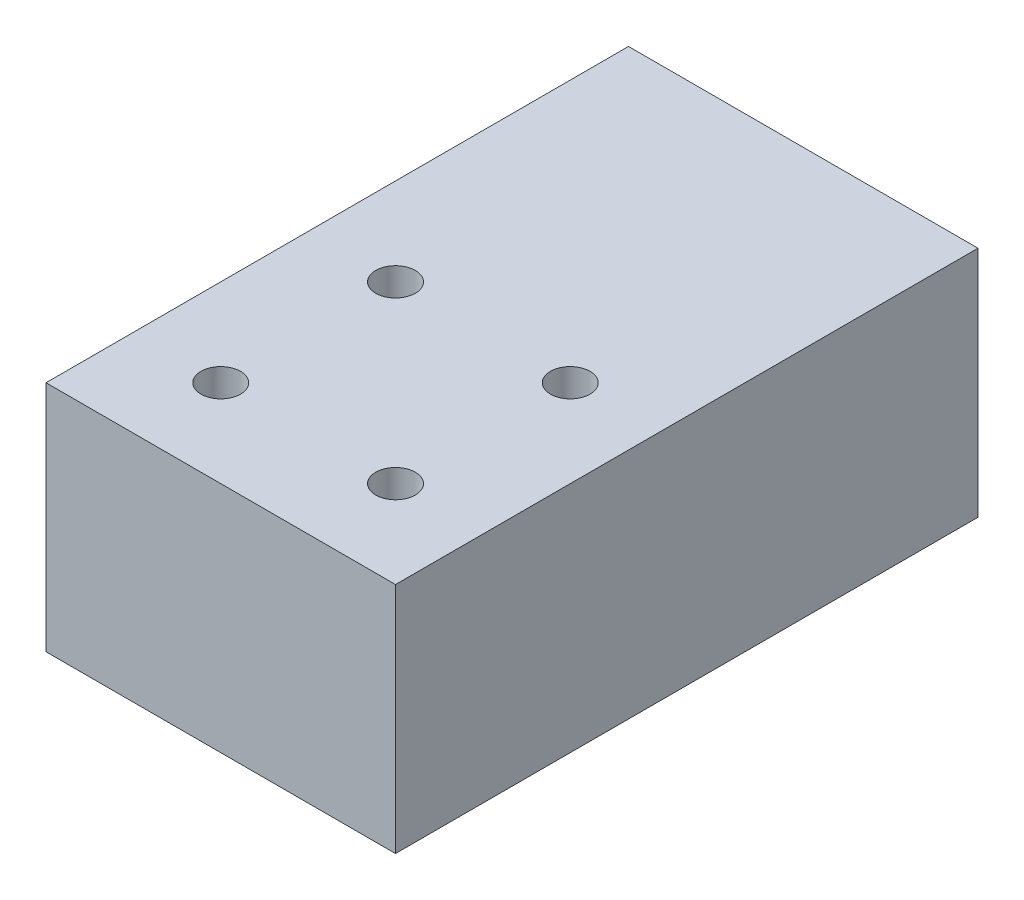
ISO-10303-21;
HEADER;
FILE_DESCRIPTION(('STEP AP214'),'2;1');
FILE_NAME('part.step','',(''),(''),'','','');
FILE_SCHEMA(('AUTOMOTIVE_DESIGN { 1 0 10303 214 1 1 1 1 }'));
ENDSEC;
DATA;
#1=APPLICATION_CONTEXT('core data for automotive mechanical design processes');
#2=APPLICATION_PROTOCOL_DEFINITION('international standard','automotive_design',2000,#1);
#3=PRODUCT_CONTEXT('',#1,'mechanical');
#4=PRODUCT('Part','Part','',(#3));
#5=PRODUCT_RELATED_PRODUCT_CATEGORY('part','',(#4));
#6=PRODUCT_DEFINITION_FORMATION('','',#4);
#7=PRODUCT_DEFINITION_CONTEXT('part definition',#1,'design');
#8=PRODUCT_DEFINITION('design','',#6,#7);
#9=PRODUCT_DEFINITION_SHAPE('','',#8);
#10=(LENGTH_UNIT() NAMED_UNIT(*) SI_UNIT(.MILLI.,.METRE.));
#11=(NAMED_UNIT(*) PLANE_ANGLE_UNIT() SI_UNIT($,.RADIAN.));
#12=(NAMED_UNIT(*) SI_UNIT($,.STERADIAN.) SOLID_ANGLE_UNIT());
#13=UNCERTAINTY_MEASURE_WITH_UNIT(LENGTH_MEASURE(1.E-05),#10,'distance_accuracy_value','');
#14=(GEOMETRIC_REPRESENTATION_CONTEXT(3) GLOBAL_UNCERTAINTY_ASSIGNED_CONTEXT((#13)) GLOBAL_UNIT_ASSIGNED_CONTEXT((#10,
#11,#12)) REPRESENTATION_CONTEXT('',''));
#15=CARTESIAN_POINT('',(0.,0.,0.));
#16=DIRECTION('',(0.,0.,1.));
#17=DIRECTION('',(1.,0.,0.));
#18=AXIS2_PLACEMENT_3D('',#15,#16,#17);
#19=CARTESIAN_POINT('',(0.,0.,50.));
#20=DIRECTION('',(1.,0.,0.));
#21=DIRECTION('',(0.,0.,-1.));
#22=AXIS2_PLACEMENT_3D('',#19,#20,#21);
#23=PLANE('',#22);
#24=DIRECTION('',(0.,-1.,0.));
#25=VECTOR('',#24,1.);
#26=CARTESIAN_POINT('',(0.,0.,0.));
#27=LINE('',#26,#25);
#28=CARTESIAN_POINT('',(0.,20.,0.));
#29=VERTEX_POINT('',#28);
#30=CARTESIAN_POINT('',(0.,0.,0.));
#31=VERTEX_POINT('',#30);
#32=EDGE_CURVE('E105',#29,#31,#27,.T.);
#33=ORIENTED_EDGE('',*,*,#32,.T.);
#34=DIRECTION('',(0.,0.,-1.));
#35=VECTOR('',#34,1.);
#36=CARTESIAN_POINT('',(0.,0.,50.));
#37=LINE('',#36,#35);
#38=CARTESIAN_POINT('',(0.,0.,50.));
#39=VERTEX_POINT('',#38);
#40=EDGE_CURVE('E11',#39,#31,#37,.T.);
#41=ORIENTED_EDGE('',*,*,#40,.F.);
#42=DIRECTION('',(0.,-1.,0.));
#43=VECTOR('',#42,1.);
#44=CARTESIAN_POINT('',(0.,0.,50.));
#45=LINE('',#44,#43);
#46=CARTESIAN_POINT('',(0.,20.,50.));
#47=VERTEX_POINT('',#46);
#48=EDGE_CURVE('E89',#47,#39,#45,.T.);
#49=ORIENTED_EDGE('',*,*,#48,.F.);
#50=DIRECTION('',(0.,0.,-1.));
#51=VECTOR('',#50,1.);
#52=CARTESIAN_POINT('',(0.,20.,50.));
#53=LINE('',#52,#51);
#54=EDGE_CURVE('E97',#47,#29,#53,.T.);
#55=ORIENTED_EDGE('',*,*,#54,.T.);
#56=EDGE_LOOP('',(#33,#41,#49,#55));
#57=FACE_BOUND('',#56,.T.);
#58=ADVANCED_FACE('F39',(#57),#23,.F.);
#59=CARTESIAN_POINT('',(0.,0.,50.));
#60=DIRECTION('',(0.,1.,0.));
#61=DIRECTION('',(0.,0.,1.));
#62=AXIS2_PLACEMENT_3D('',#59,#60,#61);
#63=PLANE('',#62);
#64=CARTESIAN_POINT('',(7.5,0.,42.5));
#65=DIRECTION('',(0.,1.,0.));
#66=DIRECTION('',(0.,0.,1.));
#67=AXIS2_PLACEMENT_3D('',#64,#65,#66);
#68=CIRCLE('',#67,1.7);
#69=CARTESIAN_POINT('',(7.5,0.,44.2));
#70=VERTEX_POINT('',#69);
#71=EDGE_CURVE('E103',#70,#70,#68,.T.);
#72=ORIENTED_EDGE('',*,*,#71,.T.);
#73=EDGE_LOOP('',(#72));
#74=FACE_BOUND('',#73,.T.);
#75=CARTESIAN_POINT('',(22.5,0.,42.5));
#76=DIRECTION('',(0.,1.,0.));
#77=DIRECTION('',(0.,0.,1.));
#78=AXIS2_PLACEMENT_3D('',#75,#76,#77);
#79=CIRCLE('',#78,1.7);
#80=CARTESIAN_POINT('',(22.5,0.,44.2));
#81=VERTEX_POINT('',#80);
#82=EDGE_CURVE('E118',#81,#81,#79,.T.);
#83=ORIENTED_EDGE('',*,*,#82,.T.);
#84=EDGE_LOOP('',(#83));
#85=FACE_BOUND('',#84,.T.);
#86=CARTESIAN_POINT('',(22.5,0.,27.5));
#87=DIRECTION('',(0.,1.,0.));
#88=DIRECTION('',(0.,0.,1.));
#89=AXIS2_PLACEMENT_3D('',#86,#87,#88);
#90=CIRCLE('',#89,1.7);
#91=CARTESIAN_POINT('',(22.5,0.,29.2));
#92=VERTEX_POINT('',#91);
#93=EDGE_CURVE('E123',#92,#92,#90,.T.);
#94=ORIENTED_EDGE('',*,*,#93,.T.);
#95=EDGE_LOOP('',(#94));
#96=FACE_BOUND('',#95,.T.);
#97=CARTESIAN_POINT('',(7.5,0.,27.5));
#98=DIRECTION('',(0.,1.,0.));
#99=DIRECTION('',(0.,0.,1.));
#100=AXIS2_PLACEMENT_3D('',#97,#98,#99);
#101=CIRCLE('',#100,1.7);
#102=CARTESIAN_POINT('',(7.5,0.,29.2));
#103=VERTEX_POINT('',#102);
#104=EDGE_CURVE('E125',#103,#103,#101,.T.);
#105=ORIENTED_EDGE('',*,*,#104,.T.);
#106=EDGE_LOOP('',(#105));
#107=FACE_BOUND('',#106,.T.);
#108=DIRECTION('',(1.,0.,0.));
#109=VECTOR('',#108,1.);
#110=CARTESIAN_POINT('',(0.,0.,0.));
#111=LINE('',#110,#109);
#112=CARTESIAN_POINT('',(30.,0.,0.));
#113=VERTEX_POINT('',#112);
#114=EDGE_CURVE('E92',#31,#113,#111,.T.);
#115=ORIENTED_EDGE('',*,*,#114,.T.);
#116=DIRECTION('',(0.,0.,-1.));
#117=VECTOR('',#116,1.);
#118=CARTESIAN_POINT('',(30.,0.,50.));
#119=LINE('',#118,#117);
#120=CARTESIAN_POINT('',(30.,0.,50.));
#121=VERTEX_POINT('',#120);
#122=EDGE_CURVE('E50',#121,#113,#119,.T.);
#123=ORIENTED_EDGE('',*,*,#122,.F.);
#124=DIRECTION('',(1.,0.,0.));
#125=VECTOR('',#124,1.);
#126=CARTESIAN_POINT('',(0.,0.,50.));
#127=LINE('',#126,#125);
#128=EDGE_CURVE('E82',#39,#121,#127,.T.);
#129=ORIENTED_EDGE('',*,*,#128,.F.);
#130=ORIENTED_EDGE('',*,*,#40,.T.);
#131=EDGE_LOOP('',(#115,#123,#129,#130));
#132=FACE_BOUND('',#131,.T.);
#133=ADVANCED_FACE('F93',(#74,#85,#96,#107,#132),#63,.F.);
#134=CARTESIAN_POINT('',(30.,0.,50.));
#135=DIRECTION('',(-1.,0.,0.));
#136=DIRECTION('',(0.,0.,1.));
#137=AXIS2_PLACEMENT_3D('',#134,#135,#136);
#138=PLANE('',#137);
#139=DIRECTION('',(0.,1.,0.));
#140=VECTOR('',#139,1.);
#141=CARTESIAN_POINT('',(30.,0.,0.));
#142=LINE('',#141,#140);
#143=CARTESIAN_POINT('',(30.,20.,0.));
#144=VERTEX_POINT('',#143);
#145=EDGE_CURVE('E75',#113,#144,#142,.T.);
#146=ORIENTED_EDGE('',*,*,#145,.T.);
#147=DIRECTION('',(0.,0.,-1.));
#148=VECTOR('',#147,1.);
#149=CARTESIAN_POINT('',(30.,20.,50.));
#150=LINE('',#149,#148);
#151=CARTESIAN_POINT('',(30.,20.,50.));
#152=VERTEX_POINT('',#151);
#153=EDGE_CURVE('E94',#152,#144,#150,.T.);
#154=ORIENTED_EDGE('',*,*,#153,.F.);
#155=DIRECTION('',(0.,1.,0.));
#156=VECTOR('',#155,1.);
#157=CARTESIAN_POINT('',(30.,0.,50.));
#158=LINE('',#157,#156);
#159=EDGE_CURVE('E88',#121,#152,#158,.T.);
#160=ORIENTED_EDGE('',*,*,#159,.F.);
#161=ORIENTED_EDGE('',*,*,#122,.T.);
#162=EDGE_LOOP('',(#146,#154,#160,#161));
#163=FACE_BOUND('',#162,.T.);
#164=ADVANCED_FACE('F96',(#163),#138,.F.);
#165=CARTESIAN_POINT('',(0.,20.,50.));
#166=DIRECTION('',(0.,-1.,0.));
#167=DIRECTION('',(0.,0.,-1.));
#168=AXIS2_PLACEMENT_3D('',#165,#166,#167);
#169=PLANE('',#168);
#170=CARTESIAN_POINT('',(7.5,20.,42.5));
#171=DIRECTION('',(0.,1.,0.));
#172=DIRECTION('',(0.,0.,1.));
#173=AXIS2_PLACEMENT_3D('',#170,#171,#172);
#174=CIRCLE('',#173,1.7);
#175=CARTESIAN_POINT('',(7.5,20.,44.2));
#176=VERTEX_POINT('',#175);
#177=EDGE_CURVE('E131',#176,#176,#174,.T.);
#178=ORIENTED_EDGE('',*,*,#177,.F.);
#179=EDGE_LOOP('',(#178));
#180=FACE_BOUND('',#179,.T.);
#181=CARTESIAN_POINT('',(22.5,20.,42.5));
#182=DIRECTION('',(0.,1.,0.));
#183=DIRECTION('',(0.,0.,1.));
#184=AXIS2_PLACEMENT_3D('',#181,#182,#183);
#185=CIRCLE('',#184,1.7);
#186=CARTESIAN_POINT('',(22.5,20.,44.2));
#187=VERTEX_POINT('',#186);
#188=EDGE_CURVE('E132',#187,#187,#185,.T.);
#189=ORIENTED_EDGE('',*,*,#188,.F.);
#190=EDGE_LOOP('',(#189));
#191=FACE_BOUND('',#190,.T.);
#192=CARTESIAN_POINT('',(22.5,20.,27.5));
#193=DIRECTION('',(0.,1.,0.));
#194=DIRECTION('',(0.,0.,1.));
#195=AXIS2_PLACEMENT_3D('',#192,#193,#194);
#196=CIRCLE('',#195,1.7);
#197=CARTESIAN_POINT('',(22.5,20.,29.2));
#198=VERTEX_POINT('',#197);
#199=EDGE_CURVE('E127',#198,#198,#196,.T.);
#200=ORIENTED_EDGE('',*,*,#199,.F.);
#201=EDGE_LOOP('',(#200));
#202=FACE_BOUND('',#201,.T.);
#203=CARTESIAN_POINT('',(7.5,20.,27.5));
#204=DIRECTION('',(0.,1.,0.));
#205=DIRECTION('',(0.,0.,1.));
#206=AXIS2_PLACEMENT_3D('',#203,#204,#205);
#207=CIRCLE('',#206,1.7);
#208=CARTESIAN_POINT('',(7.5,20.,29.2));
#209=VERTEX_POINT('',#208);
#210=EDGE_CURVE('E130',#209,#209,#207,.T.);
#211=ORIENTED_EDGE('',*,*,#210,.F.);
#212=EDGE_LOOP('',(#211));
#213=FACE_BOUND('',#212,.T.);
#214=DIRECTION('',(-1.,0.,0.));
#215=VECTOR('',#214,1.);
#216=CARTESIAN_POINT('',(0.,20.,0.));
#217=LINE('',#216,#215);
#218=EDGE_CURVE('E76',#144,#29,#217,.T.);
#219=ORIENTED_EDGE('',*,*,#218,.T.);
#220=ORIENTED_EDGE('',*,*,#54,.F.);
#221=DIRECTION('',(-1.,0.,0.));
#222=VECTOR('',#221,1.);
#223=CARTESIAN_POINT('',(0.,20.,50.));
#224=LINE('',#223,#222);
#225=EDGE_CURVE('E54',#152,#47,#224,.T.);
#226=ORIENTED_EDGE('',*,*,#225,.F.);
#227=ORIENTED_EDGE('',*,*,#153,.T.);
#228=EDGE_LOOP('',(#219,#220,#226,#227));
#229=FACE_BOUND('',#228,.T.);
#230=ADVANCED_FACE('F106',(#180,#191,#202,#213,#229),#169,.F.);
#231=CARTESIAN_POINT('',(0.,0.,50.));
#232=DIRECTION('',(0.,0.,-1.));
#233=DIRECTION('',(-1.,0.,0.));
#234=AXIS2_PLACEMENT_3D('',#231,#232,#233);
#235=PLANE('',#234);
#236=ORIENTED_EDGE('',*,*,#48,.T.);
#237=ORIENTED_EDGE('',*,*,#128,.T.);
#238=ORIENTED_EDGE('',*,*,#159,.T.);
#239=ORIENTED_EDGE('',*,*,#225,.T.);
#240=EDGE_LOOP('',(#236,#237,#238,#239));
#241=FACE_BOUND('',#240,.T.);
#242=ADVANCED_FACE('F86',(#241),#235,.F.);
#243=CARTESIAN_POINT('',(0.,0.,0.));
#244=DIRECTION('',(0.,0.,-1.));
#245=DIRECTION('',(-1.,0.,0.));
#246=AXIS2_PLACEMENT_3D('',#243,#244,#245);
#247=PLANE('',#246);
#248=ORIENTED_EDGE('',*,*,#32,.F.);
#249=ORIENTED_EDGE('',*,*,#218,.F.);
#250=ORIENTED_EDGE('',*,*,#145,.F.);
#251=ORIENTED_EDGE('',*,*,#114,.F.);
#252=EDGE_LOOP('',(#248,#249,#250,#251));
#253=FACE_BOUND('',#252,.T.);
#254=ADVANCED_FACE('F111',(#253),#247,.T.);
#255=CARTESIAN_POINT('',(7.5,-30.,27.5));
#256=DIRECTION('',(0.,1.,0.));
#257=DIRECTION('',(0.,0.,1.));
#258=AXIS2_PLACEMENT_3D('',#255,#256,#257);
#259=CYLINDRICAL_SURFACE('',#258,1.7);
#260=ORIENTED_EDGE('',*,*,#210,.T.);
#261=EDGE_LOOP('',(#260));
#262=FACE_BOUND('',#261,.T.);
#263=ORIENTED_EDGE('',*,*,#104,.F.);
#264=EDGE_LOOP('',(#263));
#265=FACE_BOUND('',#264,.T.);
#266=ADVANCED_FACE('F146',(#262,#265),#259,.F.);
#267=CARTESIAN_POINT('',(22.5,-30.,27.5));
#268=DIRECTION('',(0.,1.,0.));
#269=DIRECTION('',(0.,0.,1.));
#270=AXIS2_PLACEMENT_3D('',#267,#268,#269);
#271=CYLINDRICAL_SURFACE('',#270,1.7);
#272=ORIENTED_EDGE('',*,*,#199,.T.);
#273=EDGE_LOOP('',(#272));
#274=FACE_BOUND('',#273,.T.);
#275=ORIENTED_EDGE('',*,*,#93,.F.);
#276=EDGE_LOOP('',(#275));
#277=FACE_BOUND('',#276,.T.);
#278=ADVANCED_FACE('F139',(#274,#277),#271,.F.);
#279=CARTESIAN_POINT('',(22.5,-30.,42.5));
#280=DIRECTION('',(0.,1.,0.));
#281=DIRECTION('',(0.,0.,1.));
#282=AXIS2_PLACEMENT_3D('',#279,#280,#281);
#283=CYLINDRICAL_SURFACE('',#282,1.7);
#284=ORIENTED_EDGE('',*,*,#188,.T.);
#285=EDGE_LOOP('',(#284));
#286=FACE_BOUND('',#285,.T.);
#287=ORIENTED_EDGE('',*,*,#82,.F.);
#288=EDGE_LOOP('',(#287));
#289=FACE_BOUND('',#288,.T.);
#290=ADVANCED_FACE('F173',(#286,#289),#283,.F.);
#291=CARTESIAN_POINT('',(7.5,-30.,42.5));
#292=DIRECTION('',(0.,1.,0.));
#293=DIRECTION('',(0.,0.,1.));
#294=AXIS2_PLACEMENT_3D('',#291,#292,#293);
#295=CYLINDRICAL_SURFACE('',#294,1.7);
#296=ORIENTED_EDGE('',*,*,#177,.T.);
#297=EDGE_LOOP('',(#296));
#298=FACE_BOUND('',#297,.T.);
#299=ORIENTED_EDGE('',*,*,#71,.F.);
#300=EDGE_LOOP('',(#299));
#301=FACE_BOUND('',#300,.T.);
#302=ADVANCED_FACE('F166',(#298,#301),#295,.F.);
#303=CLOSED_SHELL('',(#58,#133,#164,#230,#242,#254,#266,#278,#290,#302));
#304=MANIFOLD_SOLID_BREP('B2',#303);
#305=ADVANCED_BREP_SHAPE_REPRESENTATION('',(#18,#304),#14);
#306=SHAPE_DEFINITION_REPRESENTATION(#9,#305);
ENDSEC;
END-ISO-10303-21;
